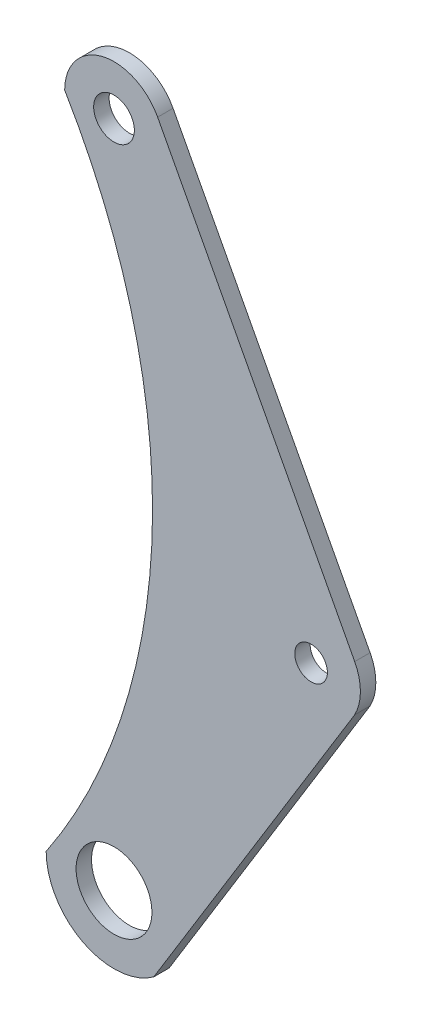
ISO-10303-21;
HEADER;
FILE_DESCRIPTION(('STEP AP214'),'2;1');
FILE_NAME('part.step','',(''),(''),'','','');
FILE_SCHEMA(('AUTOMOTIVE_DESIGN { 1 0 10303 214 1 1 1 1 }'));
ENDSEC;
DATA;
#1=APPLICATION_CONTEXT('core data for automotive mechanical design processes');
#2=APPLICATION_PROTOCOL_DEFINITION('international standard','automotive_design',2000,#1);
#3=PRODUCT_CONTEXT('',#1,'mechanical');
#4=PRODUCT('Part','Part','',(#3));
#5=PRODUCT_RELATED_PRODUCT_CATEGORY('part','',(#4));
#6=PRODUCT_DEFINITION_FORMATION('','',#4);
#7=PRODUCT_DEFINITION_CONTEXT('part definition',#1,'design');
#8=PRODUCT_DEFINITION('design','',#6,#7);
#9=PRODUCT_DEFINITION_SHAPE('','',#8);
#10=(LENGTH_UNIT() NAMED_UNIT(*) SI_UNIT(.MILLI.,.METRE.));
#11=(NAMED_UNIT(*) PLANE_ANGLE_UNIT() SI_UNIT($,.RADIAN.));
#12=(NAMED_UNIT(*) SI_UNIT($,.STERADIAN.) SOLID_ANGLE_UNIT());
#13=UNCERTAINTY_MEASURE_WITH_UNIT(LENGTH_MEASURE(1.E-05),#10,'distance_accuracy_value','');
#14=(GEOMETRIC_REPRESENTATION_CONTEXT(3) GLOBAL_UNCERTAINTY_ASSIGNED_CONTEXT((#13)) GLOBAL_UNIT_ASSIGNED_CONTEXT((#10,
#11,#12)) REPRESENTATION_CONTEXT('',''));
#15=CARTESIAN_POINT('',(0.,0.,0.));
#16=DIRECTION('',(0.,0.,1.));
#17=DIRECTION('',(1.,0.,0.));
#18=AXIS2_PLACEMENT_3D('',#15,#16,#17);
#19=CARTESIAN_POINT('',(0.,137.668,3.175));
#20=DIRECTION('',(0.,0.,-1.));
#21=DIRECTION('',(-1.,0.,0.));
#22=AXIS2_PLACEMENT_3D('',#19,#20,#21);
#23=CYLINDRICAL_SURFACE('',#22,10.16);
#24=CARTESIAN_POINT('',(0.,137.668,0.));
#25=DIRECTION('',(0.,0.,1.));
#26=DIRECTION('',(1.,0.,0.));
#27=AXIS2_PLACEMENT_3D('',#24,#25,#26);
#28=CIRCLE('',#27,10.16);
#29=CARTESIAN_POINT('',(-10.16,137.668,0.));
#30=VERTEX_POINT('',#29);
#31=CARTESIAN_POINT('',(8.98309660991346,142.414532976496,0.));
#32=VERTEX_POINT('',#31);
#33=EDGE_CURVE('E138',#30,#32,#28,.F.);
#34=ORIENTED_EDGE('',*,*,#33,.F.);
#35=DIRECTION('',(0.,0.,-1.));
#36=VECTOR('',#35,1.);
#37=CARTESIAN_POINT('',(-10.16,137.668,3.175));
#38=LINE('',#37,#36);
#39=CARTESIAN_POINT('',(-10.16,137.668,3.175));
#40=VERTEX_POINT('',#39);
#41=EDGE_CURVE('E11',#40,#30,#38,.T.);
#42=ORIENTED_EDGE('',*,*,#41,.F.);
#43=CARTESIAN_POINT('',(0.,137.668,3.175));
#44=DIRECTION('',(0.,0.,1.));
#45=DIRECTION('',(1.,0.,0.));
#46=AXIS2_PLACEMENT_3D('',#43,#44,#45);
#47=CIRCLE('',#46,10.16);
#48=CARTESIAN_POINT('',(8.98309660991346,142.414532976496,3.175));
#49=VERTEX_POINT('',#48);
#50=EDGE_CURVE('E264',#40,#49,#47,.F.);
#51=ORIENTED_EDGE('',*,*,#50,.T.);
#52=DIRECTION('',(0.,0.,-1.));
#53=VECTOR('',#52,1.);
#54=CARTESIAN_POINT('',(8.98309660991346,142.414532976496,3.175));
#55=LINE('',#54,#53);
#56=EDGE_CURVE('E63',#49,#32,#55,.T.);
#57=ORIENTED_EDGE('',*,*,#56,.T.);
#58=EDGE_LOOP('',(#34,#42,#51,#57));
#59=FACE_BOUND('',#58,.T.);
#60=ADVANCED_FACE('F46',(#59),#23,.T.);
#61=CARTESIAN_POINT('',(-120.832477812857,71.8441700501713,3.175));
#62=DIRECTION('',(0.,0.,-1.));
#63=DIRECTION('',(-1.,0.,0.));
#64=AXIS2_PLACEMENT_3D('',#61,#62,#63);
#65=CYLINDRICAL_SURFACE('',#64,128.767907238183);
#66=CARTESIAN_POINT('',(-120.832477812857,71.8441700501713,0.));
#67=DIRECTION('',(0.,0.,1.));
#68=DIRECTION('',(1.,0.,0.));
#69=AXIS2_PLACEMENT_3D('',#66,#67,#68);
#70=CIRCLE('',#69,128.767907238183);
#71=CARTESIAN_POINT('',(-13.97,0.,0.));
#72=VERTEX_POINT('',#71);
#73=EDGE_CURVE('E140',#30,#72,#70,.F.);
#74=ORIENTED_EDGE('',*,*,#73,.T.);
#75=DIRECTION('',(0.,0.,-1.));
#76=VECTOR('',#75,1.);
#77=CARTESIAN_POINT('',(-13.97,0.,3.175));
#78=LINE('',#77,#76);
#79=CARTESIAN_POINT('',(-13.97,0.,3.175));
#80=VERTEX_POINT('',#79);
#81=EDGE_CURVE('E55',#80,#72,#78,.T.);
#82=ORIENTED_EDGE('',*,*,#81,.F.);
#83=CARTESIAN_POINT('',(-120.832477812857,71.8441700501713,3.175));
#84=DIRECTION('',(0.,0.,1.));
#85=DIRECTION('',(1.,0.,0.));
#86=AXIS2_PLACEMENT_3D('',#83,#84,#85);
#87=CIRCLE('',#86,128.767907238183);
#88=EDGE_CURVE('E266',#40,#80,#87,.F.);
#89=ORIENTED_EDGE('',*,*,#88,.F.);
#90=ORIENTED_EDGE('',*,*,#41,.T.);
#91=EDGE_LOOP('',(#74,#82,#89,#90));
#92=FACE_BOUND('',#91,.T.);
#93=ADVANCED_FACE('F164',(#92),#65,.F.);
#94=CARTESIAN_POINT('',(0.,0.,3.175));
#95=DIRECTION('',(0.,0.,-1.));
#96=DIRECTION('',(-1.,0.,0.));
#97=AXIS2_PLACEMENT_3D('',#94,#95,#96);
#98=CYLINDRICAL_SURFACE('',#97,13.97);
#99=CARTESIAN_POINT('',(0.,0.,0.));
#100=DIRECTION('',(0.,0.,1.));
#101=DIRECTION('',(1.,0.,0.));
#102=AXIS2_PLACEMENT_3D('',#99,#100,#101);
#103=CIRCLE('',#102,13.97);
#104=CARTESIAN_POINT('',(8.17779026727477,-11.3262812230876,0.));
#105=VERTEX_POINT('',#104);
#106=EDGE_CURVE('E143',#105,#72,#103,.F.);
#107=ORIENTED_EDGE('',*,*,#106,.F.);
#108=DIRECTION('',(0.,0.,-1.));
#109=VECTOR('',#108,1.);
#110=CARTESIAN_POINT('',(8.17779026727477,-11.3262812230876,3.175));
#111=LINE('',#110,#109);
#112=CARTESIAN_POINT('',(8.17779026727477,-11.3262812230876,3.175));
#113=VERTEX_POINT('',#112);
#114=EDGE_CURVE('E110',#113,#105,#111,.T.);
#115=ORIENTED_EDGE('',*,*,#114,.F.);
#116=CARTESIAN_POINT('',(0.,0.,3.175));
#117=DIRECTION('',(0.,0.,1.));
#118=DIRECTION('',(1.,0.,0.));
#119=AXIS2_PLACEMENT_3D('',#116,#117,#118);
#120=CIRCLE('',#119,13.97);
#121=EDGE_CURVE('E121',#113,#80,#120,.F.);
#122=ORIENTED_EDGE('',*,*,#121,.T.);
#123=ORIENTED_EDGE('',*,*,#81,.T.);
#124=EDGE_LOOP('',(#107,#115,#122,#123));
#125=FACE_BOUND('',#124,.T.);
#126=ADVANCED_FACE('F161',(#125),#98,.T.);
#127=CARTESIAN_POINT('',(10.9897297062539,-6.74420823263941,3.175));
#128=DIRECTION('',(0.852305080484148,-0.523044978735968,0.));
#129=DIRECTION('',(0.523044978735968,0.852305080484148,0.));
#130=AXIS2_PLACEMENT_3D('',#127,#128,#129);
#131=PLANE('',#130);
#132=DIRECTION('',(-0.523044978735968,-0.852305080484148,0.));
#133=VECTOR('',#132,1.);
#134=CARTESIAN_POINT('',(10.9897297062539,-6.74420823263941,0.));
#135=LINE('',#134,#133);
#136=CARTESIAN_POINT('',(49.5659535589517,56.1159910087441,0.));
#137=VERTEX_POINT('',#136);
#138=EDGE_CURVE('E106',#137,#105,#135,.T.);
#139=ORIENTED_EDGE('',*,*,#138,.F.);
#140=DIRECTION('',(0.,0.,-1.));
#141=VECTOR('',#140,1.);
#142=CARTESIAN_POINT('',(49.5659535589517,56.1159910087441,3.175));
#143=LINE('',#142,#141);
#144=CARTESIAN_POINT('',(49.5659535589517,56.1159910087441,3.175));
#145=VERTEX_POINT('',#144);
#146=EDGE_CURVE('E101',#145,#137,#143,.T.);
#147=ORIENTED_EDGE('',*,*,#146,.F.);
#148=DIRECTION('',(-0.523044978735968,-0.852305080484148,0.));
#149=VECTOR('',#148,1.);
#150=CARTESIAN_POINT('',(10.9897297062539,-6.74420823263941,3.175));
#151=LINE('',#150,#149);
#152=EDGE_CURVE('E104',#145,#113,#151,.T.);
#153=ORIENTED_EDGE('',*,*,#152,.T.);
#154=ORIENTED_EDGE('',*,*,#114,.T.);
#155=EDGE_LOOP('',(#139,#147,#153,#154));
#156=FACE_BOUND('',#155,.T.);
#157=ADVANCED_FACE('F103',(#156),#131,.T.);
#158=CARTESIAN_POINT('',(40.5828569490383,60.8625239852398,3.175));
#159=DIRECTION('',(0.,0.,-1.));
#160=DIRECTION('',(-1.,0.,0.));
#161=AXIS2_PLACEMENT_3D('',#158,#159,#160);
#162=CYLINDRICAL_SURFACE('',#161,10.16);
#163=CARTESIAN_POINT('',(40.5828569490383,60.8625239852398,0.));
#164=DIRECTION('',(0.,0.,1.));
#165=DIRECTION('',(1.,0.,0.));
#166=AXIS2_PLACEMENT_3D('',#163,#164,#165);
#167=CIRCLE('',#166,10.16);
#168=CARTESIAN_POINT('',(49.5659535589517,65.6090569617355,0.));
#169=VERTEX_POINT('',#168);
#170=EDGE_CURVE('E147',#169,#137,#167,.F.);
#171=ORIENTED_EDGE('',*,*,#170,.F.);
#172=DIRECTION('',(0.,0.,-1.));
#173=VECTOR('',#172,1.);
#174=CARTESIAN_POINT('',(49.5659535589517,65.6090569617355,3.175));
#175=LINE('',#174,#173);
#176=CARTESIAN_POINT('',(49.5659535589517,65.6090569617355,3.175));
#177=VERTEX_POINT('',#176);
#178=EDGE_CURVE('E82',#177,#169,#175,.T.);
#179=ORIENTED_EDGE('',*,*,#178,.F.);
#180=CARTESIAN_POINT('',(40.5828569490383,60.8625239852398,3.175));
#181=DIRECTION('',(0.,0.,1.));
#182=DIRECTION('',(1.,0.,0.));
#183=AXIS2_PLACEMENT_3D('',#180,#181,#182);
#184=CIRCLE('',#183,10.16);
#185=EDGE_CURVE('E119',#177,#145,#184,.F.);
#186=ORIENTED_EDGE('',*,*,#185,.T.);
#187=ORIENTED_EDGE('',*,*,#146,.T.);
#188=EDGE_LOOP('',(#171,#179,#186,#187));
#189=FACE_BOUND('',#188,.T.);
#190=ADVANCED_FACE('F123',(#189),#162,.T.);
#191=CARTESIAN_POINT('',(65.848504693527,34.7933582987225,3.175));
#192=DIRECTION('',(0.884163052156837,0.467178442568475,0.));
#193=DIRECTION('',(-0.467178442568475,0.884163052156837,0.));
#194=AXIS2_PLACEMENT_3D('',#191,#192,#193);
#195=PLANE('',#194);
#196=DIRECTION('',(0.467178442568475,-0.884163052156838,0.));
#197=VECTOR('',#196,1.);
#198=CARTESIAN_POINT('',(65.848504693527,34.7933582987225,0.));
#199=LINE('',#198,#197);
#200=EDGE_CURVE('E149',#32,#169,#199,.T.);
#201=ORIENTED_EDGE('',*,*,#200,.F.);
#202=ORIENTED_EDGE('',*,*,#56,.F.);
#203=DIRECTION('',(0.467178442568475,-0.884163052156838,0.));
#204=VECTOR('',#203,1.);
#205=CARTESIAN_POINT('',(65.848504693527,34.7933582987225,3.175));
#206=LINE('',#205,#204);
#207=EDGE_CURVE('E124',#49,#177,#206,.T.);
#208=ORIENTED_EDGE('',*,*,#207,.T.);
#209=ORIENTED_EDGE('',*,*,#178,.T.);
#210=EDGE_LOOP('',(#201,#202,#208,#209));
#211=FACE_BOUND('',#210,.T.);
#212=ADVANCED_FACE('F168',(#211),#195,.T.);
#213=CARTESIAN_POINT('',(40.5828569490383,60.8625239852398,3.175));
#214=DIRECTION('',(0.,0.,-1.));
#215=DIRECTION('',(-1.,0.,0.));
#216=AXIS2_PLACEMENT_3D('',#213,#214,#215);
#217=CYLINDRICAL_SURFACE('',#216,3.36549999999999);
#218=CARTESIAN_POINT('',(40.5828569490383,60.8625239852398,3.175));
#219=DIRECTION('',(0.,0.,1.));
#220=DIRECTION('',(1.,0.,0.));
#221=AXIS2_PLACEMENT_3D('',#218,#219,#220);
#222=CIRCLE('',#221,3.36549999999999);
#223=CARTESIAN_POINT('',(43.9483569490383,60.8625239852398,3.175));
#224=VERTEX_POINT('',#223);
#225=EDGE_CURVE('E263',#224,#224,#222,.T.);
#226=ORIENTED_EDGE('',*,*,#225,.T.);
#227=EDGE_LOOP('',(#226));
#228=FACE_BOUND('',#227,.T.);
#229=CARTESIAN_POINT('',(40.5828569490383,60.8625239852398,0.));
#230=DIRECTION('',(0.,0.,1.));
#231=DIRECTION('',(1.,0.,0.));
#232=AXIS2_PLACEMENT_3D('',#229,#230,#231);
#233=CIRCLE('',#232,3.36549999999999);
#234=CARTESIAN_POINT('',(43.9483569490383,60.8625239852398,0.));
#235=VERTEX_POINT('',#234);
#236=EDGE_CURVE('E135',#235,#235,#233,.T.);
#237=ORIENTED_EDGE('',*,*,#236,.F.);
#238=EDGE_LOOP('',(#237));
#239=FACE_BOUND('',#238,.T.);
#240=ADVANCED_FACE('F170',(#228,#239),#217,.F.);
#241=CARTESIAN_POINT('',(0.,137.668,3.175));
#242=DIRECTION('',(0.,0.,-1.));
#243=DIRECTION('',(-1.,0.,0.));
#244=AXIS2_PLACEMENT_3D('',#241,#242,#243);
#245=CYLINDRICAL_SURFACE('',#244,4.191);
#246=CARTESIAN_POINT('',(0.,137.668,3.175));
#247=DIRECTION('',(0.,0.,1.));
#248=DIRECTION('',(1.,0.,0.));
#249=AXIS2_PLACEMENT_3D('',#246,#247,#248);
#250=CIRCLE('',#249,4.191);
#251=CARTESIAN_POINT('',(4.191,137.668,3.175));
#252=VERTEX_POINT('',#251);
#253=EDGE_CURVE('E155',#252,#252,#250,.T.);
#254=ORIENTED_EDGE('',*,*,#253,.T.);
#255=EDGE_LOOP('',(#254));
#256=FACE_BOUND('',#255,.T.);
#257=CARTESIAN_POINT('',(0.,137.668,0.));
#258=DIRECTION('',(0.,0.,1.));
#259=DIRECTION('',(1.,0.,0.));
#260=AXIS2_PLACEMENT_3D('',#257,#258,#259);
#261=CIRCLE('',#260,4.191);
#262=CARTESIAN_POINT('',(4.191,137.668,0.));
#263=VERTEX_POINT('',#262);
#264=EDGE_CURVE('E132',#263,#263,#261,.T.);
#265=ORIENTED_EDGE('',*,*,#264,.F.);
#266=EDGE_LOOP('',(#265));
#267=FACE_BOUND('',#266,.T.);
#268=ADVANCED_FACE('F48',(#256,#267),#245,.F.);
#269=CARTESIAN_POINT('',(0.,0.,3.175));
#270=DIRECTION('',(0.,0.,-1.));
#271=DIRECTION('',(-1.,0.,0.));
#272=AXIS2_PLACEMENT_3D('',#269,#270,#271);
#273=CYLINDRICAL_SURFACE('',#272,7.8105);
#274=CARTESIAN_POINT('',(0.,0.,3.175));
#275=DIRECTION('',(0.,0.,1.));
#276=DIRECTION('',(1.,0.,0.));
#277=AXIS2_PLACEMENT_3D('',#274,#275,#276);
#278=CIRCLE('',#277,7.8105);
#279=CARTESIAN_POINT('',(7.8105,0.,3.175));
#280=VERTEX_POINT('',#279);
#281=EDGE_CURVE('E126',#280,#280,#278,.T.);
#282=ORIENTED_EDGE('',*,*,#281,.T.);
#283=EDGE_LOOP('',(#282));
#284=FACE_BOUND('',#283,.T.);
#285=CARTESIAN_POINT('',(0.,0.,0.));
#286=DIRECTION('',(0.,0.,1.));
#287=DIRECTION('',(1.,0.,0.));
#288=AXIS2_PLACEMENT_3D('',#285,#286,#287);
#289=CIRCLE('',#288,7.8105);
#290=CARTESIAN_POINT('',(7.8105,0.,0.));
#291=VERTEX_POINT('',#290);
#292=EDGE_CURVE('E152',#291,#291,#289,.T.);
#293=ORIENTED_EDGE('',*,*,#292,.F.);
#294=EDGE_LOOP('',(#293));
#295=FACE_BOUND('',#294,.T.);
#296=ADVANCED_FACE('F218',(#284,#295),#273,.F.);
#297=CARTESIAN_POINT('',(0.,0.,3.175));
#298=DIRECTION('',(0.,0.,1.));
#299=DIRECTION('',(1.,0.,0.));
#300=AXIS2_PLACEMENT_3D('',#297,#298,#299);
#301=PLANE('',#300);
#302=ORIENTED_EDGE('',*,*,#253,.F.);
#303=EDGE_LOOP('',(#302));
#304=FACE_BOUND('',#303,.T.);
#305=ORIENTED_EDGE('',*,*,#225,.F.);
#306=EDGE_LOOP('',(#305));
#307=FACE_BOUND('',#306,.T.);
#308=ORIENTED_EDGE('',*,*,#50,.F.);
#309=ORIENTED_EDGE('',*,*,#88,.T.);
#310=ORIENTED_EDGE('',*,*,#121,.F.);
#311=ORIENTED_EDGE('',*,*,#152,.F.);
#312=ORIENTED_EDGE('',*,*,#185,.F.);
#313=ORIENTED_EDGE('',*,*,#207,.F.);
#314=EDGE_LOOP('',(#308,#309,#310,#311,#312,#313));
#315=FACE_BOUND('',#314,.T.);
#316=ORIENTED_EDGE('',*,*,#281,.F.);
#317=EDGE_LOOP('',(#316));
#318=FACE_BOUND('',#317,.T.);
#319=ADVANCED_FACE('F116',(#304,#307,#315,#318),#301,.T.);
#320=CARTESIAN_POINT('',(0.,0.,0.));
#321=DIRECTION('',(0.,0.,1.));
#322=DIRECTION('',(1.,0.,0.));
#323=AXIS2_PLACEMENT_3D('',#320,#321,#322);
#324=PLANE('',#323);
#325=ORIENTED_EDGE('',*,*,#264,.T.);
#326=EDGE_LOOP('',(#325));
#327=FACE_BOUND('',#326,.T.);
#328=ORIENTED_EDGE('',*,*,#236,.T.);
#329=EDGE_LOOP('',(#328));
#330=FACE_BOUND('',#329,.T.);
#331=ORIENTED_EDGE('',*,*,#33,.T.);
#332=ORIENTED_EDGE('',*,*,#200,.T.);
#333=ORIENTED_EDGE('',*,*,#170,.T.);
#334=ORIENTED_EDGE('',*,*,#138,.T.);
#335=ORIENTED_EDGE('',*,*,#106,.T.);
#336=ORIENTED_EDGE('',*,*,#73,.F.);
#337=EDGE_LOOP('',(#331,#332,#333,#334,#335,#336));
#338=FACE_BOUND('',#337,.T.);
#339=ORIENTED_EDGE('',*,*,#292,.T.);
#340=EDGE_LOOP('',(#339));
#341=FACE_BOUND('',#340,.T.);
#342=ADVANCED_FACE('F166',(#327,#330,#338,#341),#324,.F.);
#343=CLOSED_SHELL('',(#60,#93,#126,#157,#190,#212,#240,#268,#296,#319,#342));
#344=MANIFOLD_SOLID_BREP('B2',#343);
#345=ADVANCED_BREP_SHAPE_REPRESENTATION('',(#18,#344),#14);
#346=SHAPE_DEFINITION_REPRESENTATION(#9,#345);
ENDSEC;
END-ISO-10303-21;
